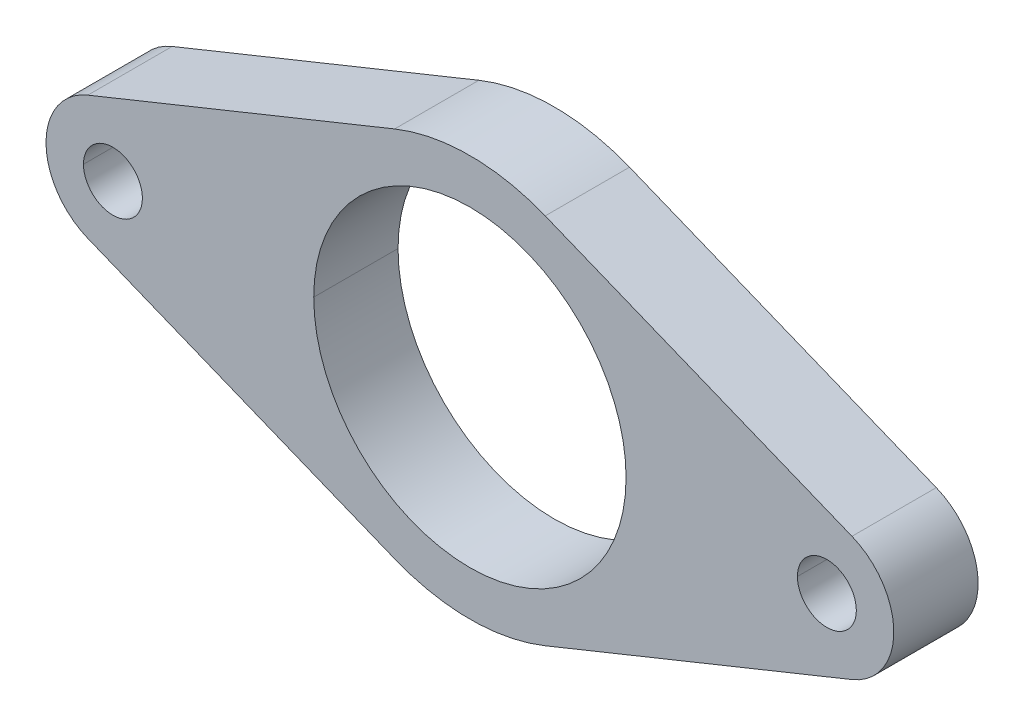
ISO-10303-21;
HEADER;
FILE_DESCRIPTION(('STEP AP214'),'2;1');
FILE_NAME('part.step','',(''),(''),'','','');
FILE_SCHEMA(('AUTOMOTIVE_DESIGN { 1 0 10303 214 1 1 1 1 }'));
ENDSEC;
DATA;
#1=APPLICATION_CONTEXT('core data for automotive mechanical design processes');
#2=APPLICATION_PROTOCOL_DEFINITION('international standard','automotive_design',2000,#1);
#3=PRODUCT_CONTEXT('',#1,'mechanical');
#4=PRODUCT('Part','Part','',(#3));
#5=PRODUCT_RELATED_PRODUCT_CATEGORY('part','',(#4));
#6=PRODUCT_DEFINITION_FORMATION('','',#4);
#7=PRODUCT_DEFINITION_CONTEXT('part definition',#1,'design');
#8=PRODUCT_DEFINITION('design','',#6,#7);
#9=PRODUCT_DEFINITION_SHAPE('','',#8);
#10=(LENGTH_UNIT() NAMED_UNIT(*) SI_UNIT(.MILLI.,.METRE.));
#11=(NAMED_UNIT(*) PLANE_ANGLE_UNIT() SI_UNIT($,.RADIAN.));
#12=(NAMED_UNIT(*) SI_UNIT($,.STERADIAN.) SOLID_ANGLE_UNIT());
#13=UNCERTAINTY_MEASURE_WITH_UNIT(LENGTH_MEASURE(1.E-05),#10,'distance_accuracy_value','');
#14=(GEOMETRIC_REPRESENTATION_CONTEXT(3) GLOBAL_UNCERTAINTY_ASSIGNED_CONTEXT((#13)) GLOBAL_UNIT_ASSIGNED_CONTEXT((#10,
#11,#12)) REPRESENTATION_CONTEXT('',''));
#15=CARTESIAN_POINT('',(0.,0.,0.));
#16=DIRECTION('',(0.,0.,1.));
#17=DIRECTION('',(1.,0.,0.));
#18=AXIS2_PLACEMENT_3D('',#15,#16,#17);
#19=CARTESIAN_POINT('',(-25.4,0.,3.));
#20=DIRECTION('',(0.,0.,1.));
#21=DIRECTION('',(1.,0.,0.));
#22=AXIS2_PLACEMENT_3D('',#19,#20,#21);
#23=CYLINDRICAL_SURFACE('',#22,2.0955);
#24=DIRECTION('',(0.,0.,1.));
#25=VECTOR('',#24,1.);
#26=CARTESIAN_POINT('',(-27.4955,0.,3.));
#27=LINE('',#26,#25);
#28=CARTESIAN_POINT('',(-27.4955,0.,-3.));
#29=VERTEX_POINT('',#28);
#30=CARTESIAN_POINT('',(-27.4955,0.,3.));
#31=VERTEX_POINT('',#30);
#32=EDGE_CURVE('E177',#29,#31,#27,.T.);
#33=ORIENTED_EDGE('',*,*,#32,.F.);
#34=CARTESIAN_POINT('',(-25.4,0.,-3.));
#35=DIRECTION('',(0.,0.,1.));
#36=DIRECTION('',(1.,0.,0.));
#37=AXIS2_PLACEMENT_3D('',#34,#35,#36);
#38=CIRCLE('',#37,2.0955);
#39=CARTESIAN_POINT('',(-23.3045,0.,-3.));
#40=VERTEX_POINT('',#39);
#41=EDGE_CURVE('E25',#40,#29,#38,.T.);
#42=ORIENTED_EDGE('',*,*,#41,.F.);
#43=DIRECTION('',(0.,0.,1.));
#44=VECTOR('',#43,1.);
#45=CARTESIAN_POINT('',(-23.3045,0.,3.));
#46=LINE('',#45,#44);
#47=CARTESIAN_POINT('',(-23.3045,0.,3.));
#48=VERTEX_POINT('',#47);
#49=EDGE_CURVE('E161',#40,#48,#46,.T.);
#50=ORIENTED_EDGE('',*,*,#49,.T.);
#51=CARTESIAN_POINT('',(-25.4,0.,3.));
#52=DIRECTION('',(0.,0.,1.));
#53=DIRECTION('',(1.,0.,0.));
#54=AXIS2_PLACEMENT_3D('',#51,#52,#53);
#55=CIRCLE('',#54,2.0955);
#56=EDGE_CURVE('E249',#48,#31,#55,.T.);
#57=ORIENTED_EDGE('',*,*,#56,.T.);
#58=EDGE_LOOP('',(#33,#42,#50,#57));
#59=FACE_BOUND('',#58,.T.);
#60=ADVANCED_FACE('F14',(#59),#23,.F.);
#61=CARTESIAN_POINT('',(25.4,0.,3.));
#62=DIRECTION('',(0.,0.,1.));
#63=DIRECTION('',(1.,0.,0.));
#64=AXIS2_PLACEMENT_3D('',#61,#62,#63);
#65=CYLINDRICAL_SURFACE('',#64,2.0955);
#66=DIRECTION('',(0.,0.,1.));
#67=VECTOR('',#66,1.);
#68=CARTESIAN_POINT('',(23.3045,0.,3.));
#69=LINE('',#68,#67);
#70=CARTESIAN_POINT('',(23.3045,0.,-3.));
#71=VERTEX_POINT('',#70);
#72=CARTESIAN_POINT('',(23.3045,0.,3.));
#73=VERTEX_POINT('',#72);
#74=EDGE_CURVE('E147',#71,#73,#69,.T.);
#75=ORIENTED_EDGE('',*,*,#74,.F.);
#76=CARTESIAN_POINT('',(25.4,0.,-3.));
#77=DIRECTION('',(0.,0.,1.));
#78=DIRECTION('',(1.,0.,0.));
#79=AXIS2_PLACEMENT_3D('',#76,#77,#78);
#80=CIRCLE('',#79,2.0955);
#81=CARTESIAN_POINT('',(27.4955,0.,-3.));
#82=VERTEX_POINT('',#81);
#83=EDGE_CURVE('E9',#82,#71,#80,.T.);
#84=ORIENTED_EDGE('',*,*,#83,.F.);
#85=DIRECTION('',(0.,0.,1.));
#86=VECTOR('',#85,1.);
#87=CARTESIAN_POINT('',(27.4955,0.,3.));
#88=LINE('',#87,#86);
#89=CARTESIAN_POINT('',(27.4955,0.,3.));
#90=VERTEX_POINT('',#89);
#91=EDGE_CURVE('E144',#82,#90,#88,.T.);
#92=ORIENTED_EDGE('',*,*,#91,.T.);
#93=CARTESIAN_POINT('',(25.4,0.,3.));
#94=DIRECTION('',(0.,0.,1.));
#95=DIRECTION('',(1.,0.,0.));
#96=AXIS2_PLACEMENT_3D('',#93,#94,#95);
#97=CIRCLE('',#96,2.0955);
#98=EDGE_CURVE('E252',#90,#73,#97,.T.);
#99=ORIENTED_EDGE('',*,*,#98,.T.);
#100=EDGE_LOOP('',(#75,#84,#92,#99));
#101=FACE_BOUND('',#100,.T.);
#102=ADVANCED_FACE('F143',(#101),#65,.F.);
#103=CARTESIAN_POINT('',(0.,0.,-3.));
#104=DIRECTION('',(0.,0.,1.));
#105=DIRECTION('',(1.,0.,0.));
#106=AXIS2_PLACEMENT_3D('',#103,#104,#105);
#107=PLANE('',#106);
#108=CARTESIAN_POINT('',(0.,0.,-3.));
#109=DIRECTION('',(0.,0.,1.));
#110=DIRECTION('',(1.,0.,0.));
#111=AXIS2_PLACEMENT_3D('',#108,#109,#110);
#112=CIRCLE('',#111,11.1125);
#113=CARTESIAN_POINT('',(-11.1125,0.,-3.));
#114=VERTEX_POINT('',#113);
#115=CARTESIAN_POINT('',(11.1125,0.,-3.));
#116=VERTEX_POINT('',#115);
#117=EDGE_CURVE('E294',#114,#116,#112,.T.);
#118=ORIENTED_EDGE('',*,*,#117,.T.);
#119=CARTESIAN_POINT('',(0.,0.,-3.));
#120=DIRECTION('',(0.,0.,1.));
#121=DIRECTION('',(1.,0.,0.));
#122=AXIS2_PLACEMENT_3D('',#119,#120,#121);
#123=CIRCLE('',#122,11.1125);
#124=EDGE_CURVE('E248',#116,#114,#123,.T.);
#125=ORIENTED_EDGE('',*,*,#124,.T.);
#126=EDGE_LOOP('',(#118,#125));
#127=FACE_BOUND('',#126,.T.);
#128=ORIENTED_EDGE('',*,*,#83,.T.);
#129=CARTESIAN_POINT('',(25.4,0.,-3.));
#130=DIRECTION('',(0.,0.,1.));
#131=DIRECTION('',(1.,0.,0.));
#132=AXIS2_PLACEMENT_3D('',#129,#130,#131);
#133=CIRCLE('',#132,2.0955);
#134=EDGE_CURVE('E18',#71,#82,#133,.T.);
#135=ORIENTED_EDGE('',*,*,#134,.T.);
#136=EDGE_LOOP('',(#128,#135));
#137=FACE_BOUND('',#136,.T.);
#138=ORIENTED_EDGE('',*,*,#41,.T.);
#139=CARTESIAN_POINT('',(-25.4,0.,-3.));
#140=DIRECTION('',(0.,0.,1.));
#141=DIRECTION('',(1.,0.,0.));
#142=AXIS2_PLACEMENT_3D('',#139,#140,#141);
#143=CIRCLE('',#142,2.0955);
#144=EDGE_CURVE('E256',#29,#40,#143,.T.);
#145=ORIENTED_EDGE('',*,*,#144,.T.);
#146=EDGE_LOOP('',(#138,#145));
#147=FACE_BOUND('',#146,.T.);
#148=DIRECTION('',(0.927024810886958,0.375,0.));
#149=VECTOR('',#148,1.);
#150=CARTESIAN_POINT('',(5.35781250000001,-13.2448669855474,-3.));
#151=LINE('',#150,#149);
#152=CARTESIAN_POINT('',(5.35781250000001,-13.2448669855474,-3.));
#153=VERTEX_POINT('',#152);
#154=CARTESIAN_POINT('',(27.1859375,-4.41495566184913,-3.));
#155=VERTEX_POINT('',#154);
#156=EDGE_CURVE('E208',#153,#155,#151,.T.);
#157=ORIENTED_EDGE('',*,*,#156,.F.);
#158=CARTESIAN_POINT('',(0.,0.,-3.));
#159=DIRECTION('',(0.,0.,1.));
#160=DIRECTION('',(1.,0.,0.));
#161=AXIS2_PLACEMENT_3D('',#158,#159,#160);
#162=CIRCLE('',#161,14.2875);
#163=CARTESIAN_POINT('',(-5.3578125,-13.2448669855474,-3.));
#164=VERTEX_POINT('',#163);
#165=EDGE_CURVE('E272',#164,#153,#162,.T.);
#166=ORIENTED_EDGE('',*,*,#165,.F.);
#167=DIRECTION('',(0.927024810886958,-0.375,0.));
#168=VECTOR('',#167,1.);
#169=CARTESIAN_POINT('',(-5.3578125,-13.2448669855474,-3.));
#170=LINE('',#169,#168);
#171=CARTESIAN_POINT('',(-27.1859375,-4.41495566184915,-3.));
#172=VERTEX_POINT('',#171);
#173=EDGE_CURVE('E242',#172,#164,#170,.T.);
#174=ORIENTED_EDGE('',*,*,#173,.F.);
#175=CARTESIAN_POINT('',(-25.4,0.,-3.));
#176=DIRECTION('',(0.,0.,1.));
#177=DIRECTION('',(1.,0.,0.));
#178=AXIS2_PLACEMENT_3D('',#175,#176,#177);
#179=CIRCLE('',#178,4.7625);
#180=CARTESIAN_POINT('',(-30.1625,0.,-3.));
#181=VERTEX_POINT('',#180);
#182=EDGE_CURVE('E209',#181,#172,#179,.T.);
#183=ORIENTED_EDGE('',*,*,#182,.F.);
#184=CARTESIAN_POINT('',(-25.4,0.,-3.));
#185=DIRECTION('',(0.,0.,1.));
#186=DIRECTION('',(1.,0.,0.));
#187=AXIS2_PLACEMENT_3D('',#184,#185,#186);
#188=CIRCLE('',#187,4.7625);
#189=CARTESIAN_POINT('',(-27.1859375,4.41495566184914,-3.));
#190=VERTEX_POINT('',#189);
#191=EDGE_CURVE('E214',#190,#181,#188,.T.);
#192=ORIENTED_EDGE('',*,*,#191,.F.);
#193=DIRECTION('',(-0.927024810886958,-0.375,0.));
#194=VECTOR('',#193,1.);
#195=CARTESIAN_POINT('',(-5.3578125,13.2448669855474,-3.));
#196=LINE('',#195,#194);
#197=CARTESIAN_POINT('',(-5.3578125,13.2448669855474,-3.));
#198=VERTEX_POINT('',#197);
#199=EDGE_CURVE('E266',#198,#190,#196,.T.);
#200=ORIENTED_EDGE('',*,*,#199,.F.);
#201=CARTESIAN_POINT('',(0.,0.,-3.));
#202=DIRECTION('',(0.,0.,1.));
#203=DIRECTION('',(1.,0.,0.));
#204=AXIS2_PLACEMENT_3D('',#201,#202,#203);
#205=CIRCLE('',#204,14.2875);
#206=CARTESIAN_POINT('',(5.35781249999999,13.2448669855474,-3.));
#207=VERTEX_POINT('',#206);
#208=EDGE_CURVE('E198',#207,#198,#205,.T.);
#209=ORIENTED_EDGE('',*,*,#208,.F.);
#210=DIRECTION('',(-0.927024810886958,0.375,0.));
#211=VECTOR('',#210,1.);
#212=CARTESIAN_POINT('',(5.3578125,13.2448669855474,-3.));
#213=LINE('',#212,#211);
#214=CARTESIAN_POINT('',(27.1859375,4.41495566184915,-3.));
#215=VERTEX_POINT('',#214);
#216=EDGE_CURVE('E199',#215,#207,#213,.T.);
#217=ORIENTED_EDGE('',*,*,#216,.F.);
#218=CARTESIAN_POINT('',(25.4,0.,-3.));
#219=DIRECTION('',(0.,0.,1.));
#220=DIRECTION('',(1.,0.,0.));
#221=AXIS2_PLACEMENT_3D('',#218,#219,#220);
#222=CIRCLE('',#221,4.7625);
#223=EDGE_CURVE('E182',#155,#215,#222,.T.);
#224=ORIENTED_EDGE('',*,*,#223,.F.);
#225=EDGE_LOOP('',(#157,#166,#174,#183,#192,#200,#209,#217,#224));
#226=FACE_BOUND('',#225,.T.);
#227=ADVANCED_FACE('F158',(#127,#137,#147,#226),#107,.F.);
#228=CARTESIAN_POINT('',(0.,0.,3.));
#229=DIRECTION('',(0.,0.,1.));
#230=DIRECTION('',(1.,0.,0.));
#231=AXIS2_PLACEMENT_3D('',#228,#229,#230);
#232=PLANE('',#231);
#233=CARTESIAN_POINT('',(0.,0.,3.));
#234=DIRECTION('',(0.,0.,1.));
#235=DIRECTION('',(1.,0.,0.));
#236=AXIS2_PLACEMENT_3D('',#233,#234,#235);
#237=CIRCLE('',#236,11.1125);
#238=CARTESIAN_POINT('',(-11.1125,0.,3.));
#239=VERTEX_POINT('',#238);
#240=CARTESIAN_POINT('',(11.1125,0.,3.));
#241=VERTEX_POINT('',#240);
#242=EDGE_CURVE('E156',#239,#241,#237,.T.);
#243=ORIENTED_EDGE('',*,*,#242,.F.);
#244=CARTESIAN_POINT('',(0.,0.,3.));
#245=DIRECTION('',(0.,0.,1.));
#246=DIRECTION('',(1.,0.,0.));
#247=AXIS2_PLACEMENT_3D('',#244,#245,#246);
#248=CIRCLE('',#247,11.1125);
#249=EDGE_CURVE('E227',#241,#239,#248,.T.);
#250=ORIENTED_EDGE('',*,*,#249,.F.);
#251=EDGE_LOOP('',(#243,#250));
#252=FACE_BOUND('',#251,.T.);
#253=ORIENTED_EDGE('',*,*,#98,.F.);
#254=CARTESIAN_POINT('',(25.4,0.,3.));
#255=DIRECTION('',(0.,0.,1.));
#256=DIRECTION('',(1.,0.,0.));
#257=AXIS2_PLACEMENT_3D('',#254,#255,#256);
#258=CIRCLE('',#257,2.0955);
#259=EDGE_CURVE('E154',#73,#90,#258,.T.);
#260=ORIENTED_EDGE('',*,*,#259,.F.);
#261=EDGE_LOOP('',(#253,#260));
#262=FACE_BOUND('',#261,.T.);
#263=ORIENTED_EDGE('',*,*,#56,.F.);
#264=CARTESIAN_POINT('',(-25.4,0.,3.));
#265=DIRECTION('',(0.,0.,1.));
#266=DIRECTION('',(1.,0.,0.));
#267=AXIS2_PLACEMENT_3D('',#264,#265,#266);
#268=CIRCLE('',#267,2.0955);
#269=EDGE_CURVE('E169',#31,#48,#268,.T.);
#270=ORIENTED_EDGE('',*,*,#269,.F.);
#271=EDGE_LOOP('',(#263,#270));
#272=FACE_BOUND('',#271,.T.);
#273=DIRECTION('',(0.927024810886958,0.375,0.));
#274=VECTOR('',#273,1.);
#275=CARTESIAN_POINT('',(5.35781250000001,-13.2448669855474,3.));
#276=LINE('',#275,#274);
#277=CARTESIAN_POINT('',(5.35781250000001,-13.2448669855474,3.));
#278=VERTEX_POINT('',#277);
#279=CARTESIAN_POINT('',(27.1859375,-4.41495566184913,3.));
#280=VERTEX_POINT('',#279);
#281=EDGE_CURVE('E188',#278,#280,#276,.T.);
#282=ORIENTED_EDGE('',*,*,#281,.T.);
#283=CARTESIAN_POINT('',(25.4,0.,3.));
#284=DIRECTION('',(0.,0.,1.));
#285=DIRECTION('',(1.,0.,0.));
#286=AXIS2_PLACEMENT_3D('',#283,#284,#285);
#287=CIRCLE('',#286,4.7625);
#288=CARTESIAN_POINT('',(27.1859375,4.41495566184915,3.));
#289=VERTEX_POINT('',#288);
#290=EDGE_CURVE('E204',#280,#289,#287,.T.);
#291=ORIENTED_EDGE('',*,*,#290,.T.);
#292=DIRECTION('',(-0.927024810886958,0.375,0.));
#293=VECTOR('',#292,1.);
#294=CARTESIAN_POINT('',(5.3578125,13.2448669855474,3.));
#295=LINE('',#294,#293);
#296=CARTESIAN_POINT('',(5.35781249999999,13.2448669855474,3.));
#297=VERTEX_POINT('',#296);
#298=EDGE_CURVE('E223',#289,#297,#295,.T.);
#299=ORIENTED_EDGE('',*,*,#298,.T.);
#300=CARTESIAN_POINT('',(0.,0.,3.));
#301=DIRECTION('',(0.,0.,1.));
#302=DIRECTION('',(1.,0.,0.));
#303=AXIS2_PLACEMENT_3D('',#300,#301,#302);
#304=CIRCLE('',#303,14.2875);
#305=CARTESIAN_POINT('',(-5.3578125,13.2448669855474,3.));
#306=VERTEX_POINT('',#305);
#307=EDGE_CURVE('E197',#297,#306,#304,.T.);
#308=ORIENTED_EDGE('',*,*,#307,.T.);
#309=DIRECTION('',(-0.927024810886958,-0.375,0.));
#310=VECTOR('',#309,1.);
#311=CARTESIAN_POINT('',(-5.3578125,13.2448669855474,3.));
#312=LINE('',#311,#310);
#313=CARTESIAN_POINT('',(-27.1859375,4.41495566184914,3.));
#314=VERTEX_POINT('',#313);
#315=EDGE_CURVE('E215',#306,#314,#312,.T.);
#316=ORIENTED_EDGE('',*,*,#315,.T.);
#317=CARTESIAN_POINT('',(-25.4,0.,3.));
#318=DIRECTION('',(0.,0.,1.));
#319=DIRECTION('',(1.,0.,0.));
#320=AXIS2_PLACEMENT_3D('',#317,#318,#319);
#321=CIRCLE('',#320,4.7625);
#322=CARTESIAN_POINT('',(-30.1625,0.,3.));
#323=VERTEX_POINT('',#322);
#324=EDGE_CURVE('E211',#314,#323,#321,.T.);
#325=ORIENTED_EDGE('',*,*,#324,.T.);
#326=CARTESIAN_POINT('',(-25.4,0.,3.));
#327=DIRECTION('',(0.,0.,1.));
#328=DIRECTION('',(1.,0.,0.));
#329=AXIS2_PLACEMENT_3D('',#326,#327,#328);
#330=CIRCLE('',#329,4.7625);
#331=CARTESIAN_POINT('',(-27.1859375,-4.41495566184915,3.));
#332=VERTEX_POINT('',#331);
#333=EDGE_CURVE('E229',#323,#332,#330,.T.);
#334=ORIENTED_EDGE('',*,*,#333,.T.);
#335=DIRECTION('',(0.927024810886958,-0.375,0.));
#336=VECTOR('',#335,1.);
#337=CARTESIAN_POINT('',(-5.3578125,-13.2448669855474,3.));
#338=LINE('',#337,#336);
#339=CARTESIAN_POINT('',(-5.3578125,-13.2448669855474,3.));
#340=VERTEX_POINT('',#339);
#341=EDGE_CURVE('E224',#332,#340,#338,.T.);
#342=ORIENTED_EDGE('',*,*,#341,.T.);
#343=CARTESIAN_POINT('',(0.,0.,3.));
#344=DIRECTION('',(0.,0.,1.));
#345=DIRECTION('',(1.,0.,0.));
#346=AXIS2_PLACEMENT_3D('',#343,#344,#345);
#347=CIRCLE('',#346,14.2875);
#348=EDGE_CURVE('E40',#340,#278,#347,.T.);
#349=ORIENTED_EDGE('',*,*,#348,.T.);
#350=EDGE_LOOP('',(#282,#291,#299,#308,#316,#325,#334,#342,#349));
#351=FACE_BOUND('',#350,.T.);
#352=ADVANCED_FACE('F16',(#252,#262,#272,#351),#232,.T.);
#353=CARTESIAN_POINT('',(0.,0.,3.));
#354=DIRECTION('',(0.,0.,-1.));
#355=DIRECTION('',(-1.,0.,0.));
#356=AXIS2_PLACEMENT_3D('',#353,#354,#355);
#357=CYLINDRICAL_SURFACE('',#356,14.2875);
#358=ORIENTED_EDGE('',*,*,#165,.T.);
#359=DIRECTION('',(0.,0.,-1.));
#360=VECTOR('',#359,1.);
#361=CARTESIAN_POINT('',(5.35781250000001,-13.2448669855474,3.));
#362=LINE('',#361,#360);
#363=EDGE_CURVE('E186',#278,#153,#362,.T.);
#364=ORIENTED_EDGE('',*,*,#363,.F.);
#365=ORIENTED_EDGE('',*,*,#348,.F.);
#366=DIRECTION('',(0.,0.,-1.));
#367=VECTOR('',#366,1.);
#368=CARTESIAN_POINT('',(-5.3578125,-13.2448669855474,3.));
#369=LINE('',#368,#367);
#370=EDGE_CURVE('E228',#340,#164,#369,.T.);
#371=ORIENTED_EDGE('',*,*,#370,.T.);
#372=EDGE_LOOP('',(#358,#364,#365,#371));
#373=FACE_BOUND('',#372,.T.);
#374=ADVANCED_FACE('F376',(#373),#357,.T.);
#375=CARTESIAN_POINT('',(0.,0.,3.));
#376=DIRECTION('',(0.,0.,-1.));
#377=DIRECTION('',(-1.,0.,0.));
#378=AXIS2_PLACEMENT_3D('',#375,#376,#377);
#379=CYLINDRICAL_SURFACE('',#378,11.1125);
#380=DIRECTION('',(0.,0.,-1.));
#381=VECTOR('',#380,1.);
#382=CARTESIAN_POINT('',(11.1125,0.,3.));
#383=LINE('',#382,#381);
#384=EDGE_CURVE('E241',#241,#116,#383,.T.);
#385=ORIENTED_EDGE('',*,*,#384,.F.);
#386=ORIENTED_EDGE('',*,*,#249,.T.);
#387=DIRECTION('',(0.,0.,-1.));
#388=VECTOR('',#387,1.);
#389=CARTESIAN_POINT('',(-11.1125,0.,3.));
#390=LINE('',#389,#388);
#391=EDGE_CURVE('E234',#239,#114,#390,.T.);
#392=ORIENTED_EDGE('',*,*,#391,.T.);
#393=ORIENTED_EDGE('',*,*,#124,.F.);
#394=EDGE_LOOP('',(#385,#386,#392,#393));
#395=FACE_BOUND('',#394,.T.);
#396=ADVANCED_FACE('F389',(#395),#379,.F.);
#397=CARTESIAN_POINT('',(-5.3578125,-13.2448669855474,3.));
#398=DIRECTION('',(0.375,0.927024810886958,0.));
#399=DIRECTION('',(0.,0.,-1.));
#400=AXIS2_PLACEMENT_3D('',#397,#398,#399);
#401=PLANE('',#400);
#402=ORIENTED_EDGE('',*,*,#173,.T.);
#403=ORIENTED_EDGE('',*,*,#370,.F.);
#404=ORIENTED_EDGE('',*,*,#341,.F.);
#405=DIRECTION('',(0.,0.,-1.));
#406=VECTOR('',#405,1.);
#407=CARTESIAN_POINT('',(-27.1859375,-4.41495566184915,3.));
#408=LINE('',#407,#406);
#409=EDGE_CURVE('E205',#332,#172,#408,.T.);
#410=ORIENTED_EDGE('',*,*,#409,.T.);
#411=EDGE_LOOP('',(#402,#403,#404,#410));
#412=FACE_BOUND('',#411,.T.);
#413=ADVANCED_FACE('F409',(#412),#401,.F.);
#414=CARTESIAN_POINT('',(-25.4,0.,3.));
#415=DIRECTION('',(0.,0.,-1.));
#416=DIRECTION('',(-1.,0.,0.));
#417=AXIS2_PLACEMENT_3D('',#414,#415,#416);
#418=CYLINDRICAL_SURFACE('',#417,4.7625);
#419=DIRECTION('',(0.,0.,-1.));
#420=VECTOR('',#419,1.);
#421=CARTESIAN_POINT('',(-30.1625,0.,3.));
#422=LINE('',#421,#420);
#423=EDGE_CURVE('E233',#323,#181,#422,.T.);
#424=ORIENTED_EDGE('',*,*,#423,.F.);
#425=ORIENTED_EDGE('',*,*,#324,.F.);
#426=DIRECTION('',(0.,0.,-1.));
#427=VECTOR('',#426,1.);
#428=CARTESIAN_POINT('',(-27.1859375,4.41495566184914,3.));
#429=LINE('',#428,#427);
#430=EDGE_CURVE('E219',#314,#190,#429,.T.);
#431=ORIENTED_EDGE('',*,*,#430,.T.);
#432=ORIENTED_EDGE('',*,*,#191,.T.);
#433=EDGE_LOOP('',(#424,#425,#431,#432));
#434=FACE_BOUND('',#433,.T.);
#435=ADVANCED_FACE('F330',(#434),#418,.T.);
#436=CARTESIAN_POINT('',(-5.3578125,13.2448669855474,3.));
#437=DIRECTION('',(0.375,-0.927024810886958,0.));
#438=DIRECTION('',(0.,0.,-1.));
#439=AXIS2_PLACEMENT_3D('',#436,#437,#438);
#440=PLANE('',#439);
#441=ORIENTED_EDGE('',*,*,#199,.T.);
#442=ORIENTED_EDGE('',*,*,#430,.F.);
#443=ORIENTED_EDGE('',*,*,#315,.F.);
#444=DIRECTION('',(0.,0.,-1.));
#445=VECTOR('',#444,1.);
#446=CARTESIAN_POINT('',(-5.3578125,13.2448669855474,3.));
#447=LINE('',#446,#445);
#448=EDGE_CURVE('E193',#306,#198,#447,.T.);
#449=ORIENTED_EDGE('',*,*,#448,.T.);
#450=EDGE_LOOP('',(#441,#442,#443,#449));
#451=FACE_BOUND('',#450,.T.);
#452=ADVANCED_FACE('F333',(#451),#440,.F.);
#453=CARTESIAN_POINT('',(0.,0.,3.));
#454=DIRECTION('',(0.,0.,-1.));
#455=DIRECTION('',(-1.,0.,0.));
#456=AXIS2_PLACEMENT_3D('',#453,#454,#455);
#457=CYLINDRICAL_SURFACE('',#456,14.2875);
#458=ORIENTED_EDGE('',*,*,#208,.T.);
#459=ORIENTED_EDGE('',*,*,#448,.F.);
#460=ORIENTED_EDGE('',*,*,#307,.F.);
#461=DIRECTION('',(0.,0.,-1.));
#462=VECTOR('',#461,1.);
#463=CARTESIAN_POINT('',(5.35781249999999,13.2448669855474,3.));
#464=LINE('',#463,#462);
#465=EDGE_CURVE('E203',#297,#207,#464,.T.);
#466=ORIENTED_EDGE('',*,*,#465,.T.);
#467=EDGE_LOOP('',(#458,#459,#460,#466));
#468=FACE_BOUND('',#467,.T.);
#469=ADVANCED_FACE('F400',(#468),#457,.T.);
#470=CARTESIAN_POINT('',(5.3578125,13.2448669855474,3.));
#471=DIRECTION('',(-0.375,-0.927024810886958,0.));
#472=DIRECTION('',(-0.927024810886958,0.375,0.));
#473=AXIS2_PLACEMENT_3D('',#470,#471,#472);
#474=PLANE('',#473);
#475=ORIENTED_EDGE('',*,*,#216,.T.);
#476=ORIENTED_EDGE('',*,*,#465,.F.);
#477=ORIENTED_EDGE('',*,*,#298,.F.);
#478=DIRECTION('',(0.,0.,-1.));
#479=VECTOR('',#478,1.);
#480=CARTESIAN_POINT('',(27.1859375,4.41495566184915,3.));
#481=LINE('',#480,#479);
#482=EDGE_CURVE('E185',#289,#215,#481,.T.);
#483=ORIENTED_EDGE('',*,*,#482,.T.);
#484=EDGE_LOOP('',(#475,#476,#477,#483));
#485=FACE_BOUND('',#484,.T.);
#486=ADVANCED_FACE('F466',(#485),#474,.F.);
#487=CARTESIAN_POINT('',(25.4,0.,3.));
#488=DIRECTION('',(0.,0.,-1.));
#489=DIRECTION('',(-1.,0.,0.));
#490=AXIS2_PLACEMENT_3D('',#487,#488,#489);
#491=CYLINDRICAL_SURFACE('',#490,4.7625);
#492=ORIENTED_EDGE('',*,*,#223,.T.);
#493=ORIENTED_EDGE('',*,*,#482,.F.);
#494=ORIENTED_EDGE('',*,*,#290,.F.);
#495=DIRECTION('',(0.,0.,-1.));
#496=VECTOR('',#495,1.);
#497=CARTESIAN_POINT('',(27.1859375,-4.41495566184913,3.));
#498=LINE('',#497,#496);
#499=EDGE_CURVE('E192',#280,#155,#498,.T.);
#500=ORIENTED_EDGE('',*,*,#499,.T.);
#501=EDGE_LOOP('',(#492,#493,#494,#500));
#502=FACE_BOUND('',#501,.T.);
#503=ADVANCED_FACE('F471',(#502),#491,.T.);
#504=CARTESIAN_POINT('',(5.35781250000001,-13.2448669855474,3.));
#505=DIRECTION('',(-0.375,0.927024810886958,0.));
#506=DIRECTION('',(0.,0.,1.));
#507=AXIS2_PLACEMENT_3D('',#504,#505,#506);
#508=PLANE('',#507);
#509=ORIENTED_EDGE('',*,*,#156,.T.);
#510=ORIENTED_EDGE('',*,*,#499,.F.);
#511=ORIENTED_EDGE('',*,*,#281,.F.);
#512=ORIENTED_EDGE('',*,*,#363,.T.);
#513=EDGE_LOOP('',(#509,#510,#511,#512));
#514=FACE_BOUND('',#513,.T.);
#515=ADVANCED_FACE('F516',(#514),#508,.F.);
#516=CARTESIAN_POINT('',(-25.4,0.,3.));
#517=DIRECTION('',(0.,0.,-1.));
#518=DIRECTION('',(-1.,0.,0.));
#519=AXIS2_PLACEMENT_3D('',#516,#517,#518);
#520=CYLINDRICAL_SURFACE('',#519,4.7625);
#521=ORIENTED_EDGE('',*,*,#333,.F.);
#522=ORIENTED_EDGE('',*,*,#423,.T.);
#523=ORIENTED_EDGE('',*,*,#182,.T.);
#524=ORIENTED_EDGE('',*,*,#409,.F.);
#525=EDGE_LOOP('',(#521,#522,#523,#524));
#526=FACE_BOUND('',#525,.T.);
#527=ADVANCED_FACE('F342',(#526),#520,.T.);
#528=CARTESIAN_POINT('',(0.,0.,3.));
#529=DIRECTION('',(0.,0.,-1.));
#530=DIRECTION('',(-1.,0.,0.));
#531=AXIS2_PLACEMENT_3D('',#528,#529,#530);
#532=CYLINDRICAL_SURFACE('',#531,11.1125);
#533=ORIENTED_EDGE('',*,*,#242,.T.);
#534=ORIENTED_EDGE('',*,*,#384,.T.);
#535=ORIENTED_EDGE('',*,*,#117,.F.);
#536=ORIENTED_EDGE('',*,*,#391,.F.);
#537=EDGE_LOOP('',(#533,#534,#535,#536));
#538=FACE_BOUND('',#537,.T.);
#539=ADVANCED_FACE('F445',(#538),#532,.F.);
#540=CARTESIAN_POINT('',(25.4,0.,3.));
#541=DIRECTION('',(0.,0.,1.));
#542=DIRECTION('',(1.,0.,0.));
#543=AXIS2_PLACEMENT_3D('',#540,#541,#542);
#544=CYLINDRICAL_SURFACE('',#543,2.0955);
#545=ORIENTED_EDGE('',*,*,#134,.F.);
#546=ORIENTED_EDGE('',*,*,#74,.T.);
#547=ORIENTED_EDGE('',*,*,#259,.T.);
#548=ORIENTED_EDGE('',*,*,#91,.F.);
#549=EDGE_LOOP('',(#545,#546,#547,#548));
#550=FACE_BOUND('',#549,.T.);
#551=ADVANCED_FACE('F152',(#550),#544,.F.);
#552=CARTESIAN_POINT('',(-25.4,0.,3.));
#553=DIRECTION('',(0.,0.,1.));
#554=DIRECTION('',(1.,0.,0.));
#555=AXIS2_PLACEMENT_3D('',#552,#553,#554);
#556=CYLINDRICAL_SURFACE('',#555,2.0955);
#557=ORIENTED_EDGE('',*,*,#144,.F.);
#558=ORIENTED_EDGE('',*,*,#32,.T.);
#559=ORIENTED_EDGE('',*,*,#269,.T.);
#560=ORIENTED_EDGE('',*,*,#49,.F.);
#561=EDGE_LOOP('',(#557,#558,#559,#560));
#562=FACE_BOUND('',#561,.T.);
#563=ADVANCED_FACE('F444',(#562),#556,.F.);
#564=CLOSED_SHELL('',(#60,#102,#227,#352,#374,#396,#413,#435,#452,#469,#486,#503,#515,#527,#539,
#551,#563));
#565=MANIFOLD_SOLID_BREP('B1',#564);
#566=ADVANCED_BREP_SHAPE_REPRESENTATION('',(#18,#565),#14);
#567=SHAPE_DEFINITION_REPRESENTATION(#9,#566);
ENDSEC;
END-ISO-10303-21;
